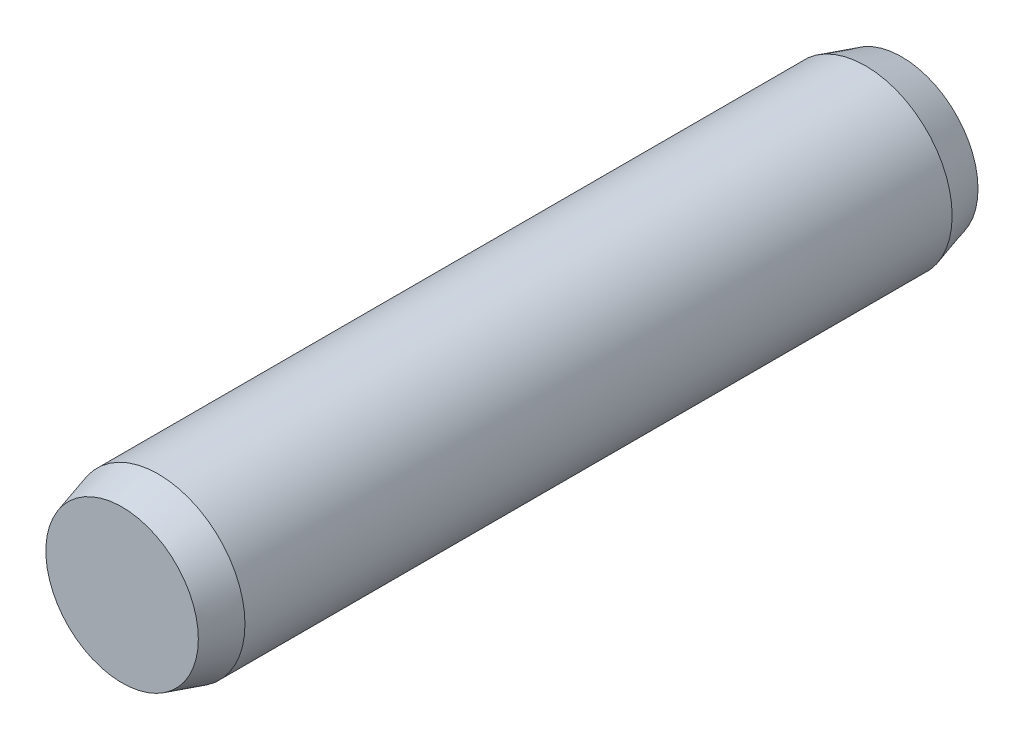
ISO-10303-21;
HEADER;
FILE_DESCRIPTION(('STEP AP214'),'2;1');
FILE_NAME('part.step','',(''),(''),'','','');
FILE_SCHEMA(('AUTOMOTIVE_DESIGN { 1 0 10303 214 1 1 1 1 }'));
ENDSEC;
DATA;
#1=APPLICATION_CONTEXT('core data for automotive mechanical design processes');
#2=APPLICATION_PROTOCOL_DEFINITION('international standard','automotive_design',2000,#1);
#3=PRODUCT_CONTEXT('',#1,'mechanical');
#4=PRODUCT('Part','Part','',(#3));
#5=PRODUCT_RELATED_PRODUCT_CATEGORY('part','',(#4));
#6=PRODUCT_DEFINITION_FORMATION('','',#4);
#7=PRODUCT_DEFINITION_CONTEXT('part definition',#1,'design');
#8=PRODUCT_DEFINITION('design','',#6,#7);
#9=PRODUCT_DEFINITION_SHAPE('','',#8);
#10=(LENGTH_UNIT() NAMED_UNIT(*) SI_UNIT(.MILLI.,.METRE.));
#11=(NAMED_UNIT(*) PLANE_ANGLE_UNIT() SI_UNIT($,.RADIAN.));
#12=(NAMED_UNIT(*) SI_UNIT($,.STERADIAN.) SOLID_ANGLE_UNIT());
#13=UNCERTAINTY_MEASURE_WITH_UNIT(LENGTH_MEASURE(1.E-05),#10,'distance_accuracy_value','');
#14=(GEOMETRIC_REPRESENTATION_CONTEXT(3) GLOBAL_UNCERTAINTY_ASSIGNED_CONTEXT((#13)) GLOBAL_UNIT_ASSIGNED_CONTEXT((#10,
#11,#12)) REPRESENTATION_CONTEXT('',''));
#15=CARTESIAN_POINT('',(0.,0.,0.));
#16=DIRECTION('',(0.,0.,1.));
#17=DIRECTION('',(1.,0.,0.));
#18=AXIS2_PLACEMENT_3D('',#15,#16,#17);
#19=CARTESIAN_POINT('',(0.,0.,7.14375));
#20=DIRECTION('',(0.,0.,-1.));
#21=DIRECTION('',(-1.,0.,0.));
#22=AXIS2_PLACEMENT_3D('',#19,#20,#21);
#23=PLANE('',#22);
#24=CARTESIAN_POINT('',(0.,0.,7.14375));
#25=DIRECTION('',(0.,0.,1.));
#26=DIRECTION('',(1.,0.,0.));
#27=AXIS2_PLACEMENT_3D('',#24,#25,#26);
#28=CIRCLE('',#27,1.397);
#29=CARTESIAN_POINT('',(1.397,0.,7.14375));
#30=VERTEX_POINT('',#29);
#31=EDGE_CURVE('E10',#30,#30,#28,.T.);
#32=ORIENTED_EDGE('',*,*,#31,.T.);
#33=EDGE_LOOP('',(#32));
#34=FACE_BOUND('',#33,.T.);
#35=ADVANCED_FACE('F43',(#34),#23,.F.);
#36=CARTESIAN_POINT('',(0.,0.,6.47939754844831));
#37=DIRECTION('',(0.,0.,-1.));
#38=DIRECTION('',(-1.,0.,0.));
#39=AXIS2_PLACEMENT_3D('',#36,#37,#38);
#40=CONICAL_SURFACE('',#39,1.5875,0.279252680319093);
#41=ORIENTED_EDGE('',*,*,#31,.F.);
#42=EDGE_LOOP('',(#41));
#43=FACE_BOUND('',#42,.T.);
#44=CARTESIAN_POINT('',(0.,0.,6.47939754844831));
#45=DIRECTION('',(0.,0.,1.));
#46=DIRECTION('',(1.,0.,0.));
#47=AXIS2_PLACEMENT_3D('',#44,#45,#46);
#48=CIRCLE('',#47,1.5875);
#49=CARTESIAN_POINT('',(1.5875,0.,6.47939754844831));
#50=VERTEX_POINT('',#49);
#51=EDGE_CURVE('E50',#50,#50,#48,.T.);
#52=ORIENTED_EDGE('',*,*,#51,.T.);
#53=EDGE_LOOP('',(#52));
#54=FACE_BOUND('',#53,.T.);
#55=ADVANCED_FACE('F82',(#43,#54),#40,.T.);
#56=CARTESIAN_POINT('',(0.,0.,7.14375));
#57=DIRECTION('',(0.,0.,1.));
#58=DIRECTION('',(1.,0.,0.));
#59=AXIS2_PLACEMENT_3D('',#56,#57,#58);
#60=CYLINDRICAL_SURFACE('',#59,1.5875);
#61=ORIENTED_EDGE('',*,*,#51,.F.);
#62=EDGE_LOOP('',(#61));
#63=FACE_BOUND('',#62,.T.);
#64=CARTESIAN_POINT('',(0.,0.,-6.47939754844831));
#65=DIRECTION('',(0.,0.,1.));
#66=DIRECTION('',(1.,0.,0.));
#67=AXIS2_PLACEMENT_3D('',#64,#65,#66);
#68=CIRCLE('',#67,1.5875);
#69=CARTESIAN_POINT('',(1.5875,0.,-6.47939754844831));
#70=VERTEX_POINT('',#69);
#71=EDGE_CURVE('E56',#70,#70,#68,.T.);
#72=ORIENTED_EDGE('',*,*,#71,.T.);
#73=EDGE_LOOP('',(#72));
#74=FACE_BOUND('',#73,.T.);
#75=ADVANCED_FACE('F78',(#63,#74),#60,.T.);
#76=CARTESIAN_POINT('',(0.,0.,-7.14375));
#77=DIRECTION('',(0.,0.,1.));
#78=DIRECTION('',(1.,0.,0.));
#79=AXIS2_PLACEMENT_3D('',#76,#77,#78);
#80=CONICAL_SURFACE('',#79,1.397,0.279252680319093);
#81=ORIENTED_EDGE('',*,*,#71,.F.);
#82=EDGE_LOOP('',(#81));
#83=FACE_BOUND('',#82,.T.);
#84=CARTESIAN_POINT('',(0.,0.,-7.14375));
#85=DIRECTION('',(0.,0.,1.));
#86=DIRECTION('',(1.,0.,0.));
#87=AXIS2_PLACEMENT_3D('',#84,#85,#86);
#88=CIRCLE('',#87,1.397);
#89=CARTESIAN_POINT('',(1.397,0.,-7.14375));
#90=VERTEX_POINT('',#89);
#91=EDGE_CURVE('E62',#90,#90,#88,.T.);
#92=ORIENTED_EDGE('',*,*,#91,.T.);
#93=EDGE_LOOP('',(#92));
#94=FACE_BOUND('',#93,.T.);
#95=ADVANCED_FACE('F70',(#83,#94),#80,.T.);
#96=CARTESIAN_POINT('',(0.,1.397,-7.14375));
#97=DIRECTION('',(0.,0.,1.));
#98=DIRECTION('',(1.,0.,0.));
#99=AXIS2_PLACEMENT_3D('',#96,#97,#98);
#100=PLANE('',#99);
#101=ORIENTED_EDGE('',*,*,#91,.F.);
#102=EDGE_LOOP('',(#101));
#103=FACE_BOUND('',#102,.T.);
#104=ADVANCED_FACE('F72',(#103),#100,.F.);
#105=CLOSED_SHELL('',(#35,#55,#75,#95,#104));
#106=MANIFOLD_SOLID_BREP('B2',#105);
#107=ADVANCED_BREP_SHAPE_REPRESENTATION('',(#18,#106),#14);
#108=SHAPE_DEFINITION_REPRESENTATION(#9,#107);
ENDSEC;
END-ISO-10303-21;
